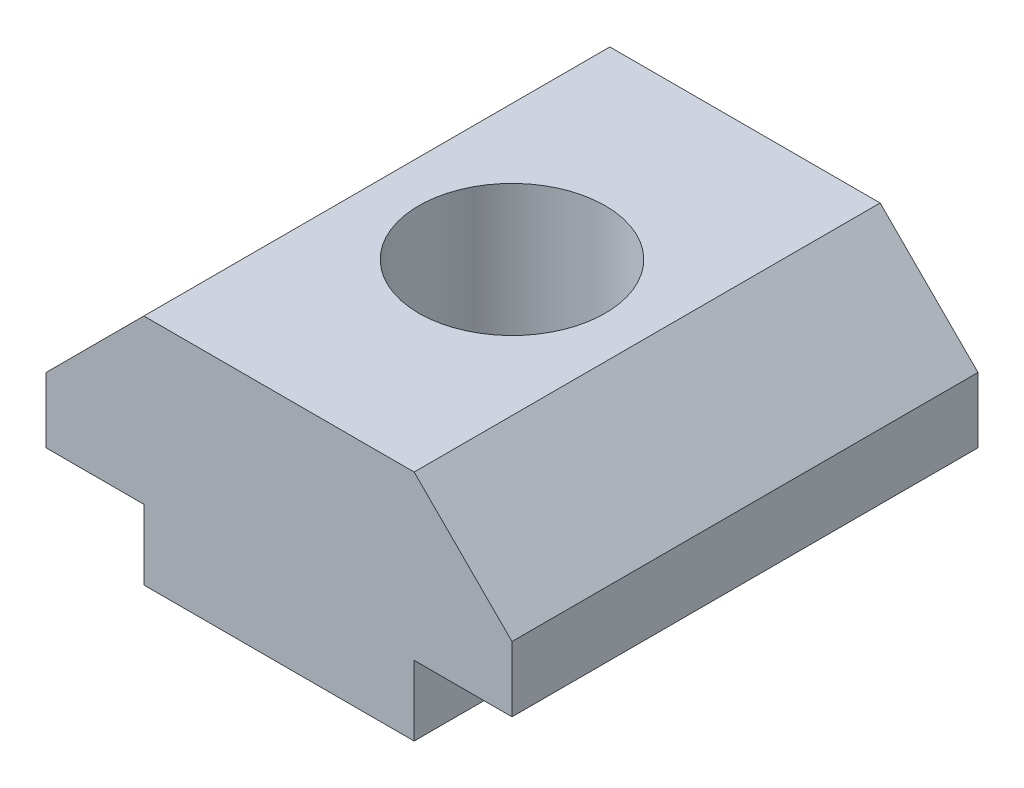
ISO-10303-21;
HEADER;
FILE_DESCRIPTION(('STEP AP214'),'2;1');
FILE_NAME('part.step','',(''),(''),'','','');
FILE_SCHEMA(('AUTOMOTIVE_DESIGN { 1 0 10303 214 1 1 1 1 }'));
ENDSEC;
DATA;
#1=APPLICATION_CONTEXT('core data for automotive mechanical design processes');
#2=APPLICATION_PROTOCOL_DEFINITION('international standard','automotive_design',2000,#1);
#3=PRODUCT_CONTEXT('',#1,'mechanical');
#4=PRODUCT('Part','Part','',(#3));
#5=PRODUCT_RELATED_PRODUCT_CATEGORY('part','',(#4));
#6=PRODUCT_DEFINITION_FORMATION('','',#4);
#7=PRODUCT_DEFINITION_CONTEXT('part definition',#1,'design');
#8=PRODUCT_DEFINITION('design','',#6,#7);
#9=PRODUCT_DEFINITION_SHAPE('','',#8);
#10=(LENGTH_UNIT() NAMED_UNIT(*) SI_UNIT(.MILLI.,.METRE.));
#11=(NAMED_UNIT(*) PLANE_ANGLE_UNIT() SI_UNIT($,.RADIAN.));
#12=(NAMED_UNIT(*) SI_UNIT($,.STERADIAN.) SOLID_ANGLE_UNIT());
#13=UNCERTAINTY_MEASURE_WITH_UNIT(LENGTH_MEASURE(1.E-05),#10,'distance_accuracy_value','');
#14=(GEOMETRIC_REPRESENTATION_CONTEXT(3) GLOBAL_UNCERTAINTY_ASSIGNED_CONTEXT((#13)) GLOBAL_UNIT_ASSIGNED_CONTEXT((#10,
#11,#12)) REPRESENTATION_CONTEXT('',''));
#15=CARTESIAN_POINT('',(0.,0.,0.));
#16=DIRECTION('',(0.,0.,1.));
#17=DIRECTION('',(1.,0.,0.));
#18=AXIS2_PLACEMENT_3D('',#15,#16,#17);
#19=CARTESIAN_POINT('',(-2.9,1.5,-10.));
#20=DIRECTION('',(-1.,0.,0.));
#21=DIRECTION('',(0.,-1.,0.));
#22=AXIS2_PLACEMENT_3D('',#19,#20,#21);
#23=PLANE('',#22);
#24=DIRECTION('',(0.,-1.,0.));
#25=VECTOR('',#24,1.);
#26=CARTESIAN_POINT('',(-2.9,1.5,0.));
#27=LINE('',#26,#25);
#28=CARTESIAN_POINT('',(-2.9,1.5,0.));
#29=VERTEX_POINT('',#28);
#30=CARTESIAN_POINT('',(-2.9,0.,0.));
#31=VERTEX_POINT('',#30);
#32=EDGE_CURVE('E143',#29,#31,#27,.T.);
#33=ORIENTED_EDGE('',*,*,#32,.F.);
#34=DIRECTION('',(0.,0.,1.));
#35=VECTOR('',#34,1.);
#36=CARTESIAN_POINT('',(-2.9,1.5,-10.));
#37=LINE('',#36,#35);
#38=CARTESIAN_POINT('',(-2.9,1.5,-10.));
#39=VERTEX_POINT('',#38);
#40=EDGE_CURVE('E11',#39,#29,#37,.T.);
#41=ORIENTED_EDGE('',*,*,#40,.F.);
#42=DIRECTION('',(0.,-1.,0.));
#43=VECTOR('',#42,1.);
#44=CARTESIAN_POINT('',(-2.9,1.5,-10.));
#45=LINE('',#44,#43);
#46=CARTESIAN_POINT('',(-2.9,0.,-10.));
#47=VERTEX_POINT('',#46);
#48=EDGE_CURVE('E170',#39,#47,#45,.T.);
#49=ORIENTED_EDGE('',*,*,#48,.T.);
#50=DIRECTION('',(0.,0.,1.));
#51=VECTOR('',#50,1.);
#52=CARTESIAN_POINT('',(-2.9,0.,-10.));
#53=LINE('',#52,#51);
#54=EDGE_CURVE('E37',#47,#31,#53,.T.);
#55=ORIENTED_EDGE('',*,*,#54,.T.);
#56=EDGE_LOOP('',(#33,#41,#49,#55));
#57=FACE_BOUND('',#56,.T.);
#58=ADVANCED_FACE('F34',(#57),#23,.T.);
#59=CARTESIAN_POINT('',(-5.,1.5,-10.));
#60=DIRECTION('',(0.,-1.,0.));
#61=DIRECTION('',(0.,0.,-1.));
#62=AXIS2_PLACEMENT_3D('',#59,#60,#61);
#63=PLANE('',#62);
#64=DIRECTION('',(1.,0.,0.));
#65=VECTOR('',#64,1.);
#66=CARTESIAN_POINT('',(-5.,1.5,0.));
#67=LINE('',#66,#65);
#68=CARTESIAN_POINT('',(-5.,1.5,0.));
#69=VERTEX_POINT('',#68);
#70=EDGE_CURVE('E168',#69,#29,#67,.T.);
#71=ORIENTED_EDGE('',*,*,#70,.F.);
#72=DIRECTION('',(0.,0.,1.));
#73=VECTOR('',#72,1.);
#74=CARTESIAN_POINT('',(-5.,1.5,-10.));
#75=LINE('',#74,#73);
#76=CARTESIAN_POINT('',(-5.,1.5,-10.));
#77=VERTEX_POINT('',#76);
#78=EDGE_CURVE('E43',#77,#69,#75,.T.);
#79=ORIENTED_EDGE('',*,*,#78,.F.);
#80=DIRECTION('',(1.,0.,0.));
#81=VECTOR('',#80,1.);
#82=CARTESIAN_POINT('',(-5.,1.5,-10.));
#83=LINE('',#82,#81);
#84=EDGE_CURVE('E133',#77,#39,#83,.T.);
#85=ORIENTED_EDGE('',*,*,#84,.T.);
#86=ORIENTED_EDGE('',*,*,#40,.T.);
#87=EDGE_LOOP('',(#71,#79,#85,#86));
#88=FACE_BOUND('',#87,.T.);
#89=ADVANCED_FACE('F186',(#88),#63,.T.);
#90=CARTESIAN_POINT('',(-5.,2.89999999999999,-10.));
#91=DIRECTION('',(-1.,0.,0.));
#92=DIRECTION('',(0.,-1.,0.));
#93=AXIS2_PLACEMENT_3D('',#90,#91,#92);
#94=PLANE('',#93);
#95=DIRECTION('',(0.,-1.,0.));
#96=VECTOR('',#95,1.);
#97=CARTESIAN_POINT('',(-5.,2.89999999999999,0.));
#98=LINE('',#97,#96);
#99=CARTESIAN_POINT('',(-5.,2.89999999999999,0.));
#100=VERTEX_POINT('',#99);
#101=EDGE_CURVE('E120',#100,#69,#98,.T.);
#102=ORIENTED_EDGE('',*,*,#101,.F.);
#103=DIRECTION('',(0.,0.,1.));
#104=VECTOR('',#103,1.);
#105=CARTESIAN_POINT('',(-5.,2.89999999999999,-10.));
#106=LINE('',#105,#104);
#107=CARTESIAN_POINT('',(-5.,2.89999999999999,-10.));
#108=VERTEX_POINT('',#107);
#109=EDGE_CURVE('E115',#108,#100,#106,.T.);
#110=ORIENTED_EDGE('',*,*,#109,.F.);
#111=DIRECTION('',(0.,-1.,0.));
#112=VECTOR('',#111,1.);
#113=CARTESIAN_POINT('',(-5.,2.89999999999999,-10.));
#114=LINE('',#113,#112);
#115=EDGE_CURVE('E118',#108,#77,#114,.T.);
#116=ORIENTED_EDGE('',*,*,#115,.T.);
#117=ORIENTED_EDGE('',*,*,#78,.T.);
#118=EDGE_LOOP('',(#102,#110,#116,#117));
#119=FACE_BOUND('',#118,.T.);
#120=ADVANCED_FACE('F117',(#119),#94,.T.);
#121=CARTESIAN_POINT('',(-2.9,5.,-10.));
#122=DIRECTION('',(-0.707106781186549,0.707106781186546,0.));
#123=DIRECTION('',(-0.707106781186546,-0.707106781186549,0.));
#124=AXIS2_PLACEMENT_3D('',#121,#122,#123);
#125=PLANE('',#124);
#126=DIRECTION('',(-0.707106781186546,-0.707106781186549,0.));
#127=VECTOR('',#126,1.);
#128=CARTESIAN_POINT('',(-2.9,5.,0.));
#129=LINE('',#128,#127);
#130=CARTESIAN_POINT('',(-2.9,5.,0.));
#131=VERTEX_POINT('',#130);
#132=EDGE_CURVE('E165',#131,#100,#129,.T.);
#133=ORIENTED_EDGE('',*,*,#132,.F.);
#134=DIRECTION('',(0.,0.,1.));
#135=VECTOR('',#134,1.);
#136=CARTESIAN_POINT('',(-2.9,5.,-10.));
#137=LINE('',#136,#135);
#138=CARTESIAN_POINT('',(-2.9,5.,-10.));
#139=VERTEX_POINT('',#138);
#140=EDGE_CURVE('E125',#139,#131,#137,.T.);
#141=ORIENTED_EDGE('',*,*,#140,.F.);
#142=DIRECTION('',(-0.707106781186546,-0.707106781186549,0.));
#143=VECTOR('',#142,1.);
#144=CARTESIAN_POINT('',(-2.9,5.,-10.));
#145=LINE('',#144,#143);
#146=EDGE_CURVE('E131',#139,#108,#145,.T.);
#147=ORIENTED_EDGE('',*,*,#146,.T.);
#148=ORIENTED_EDGE('',*,*,#109,.T.);
#149=EDGE_LOOP('',(#133,#141,#147,#148));
#150=FACE_BOUND('',#149,.T.);
#151=ADVANCED_FACE('F135',(#150),#125,.T.);
#152=CARTESIAN_POINT('',(2.9,5.,-10.));
#153=DIRECTION('',(0.,1.,0.));
#154=DIRECTION('',(0.,0.,1.));
#155=AXIS2_PLACEMENT_3D('',#152,#153,#154);
#156=PLANE('',#155);
#157=CARTESIAN_POINT('',(0.,5.,-4.99999999999773));
#158=DIRECTION('',(0.,1.,0.));
#159=DIRECTION('',(0.,0.,1.));
#160=AXIS2_PLACEMENT_3D('',#157,#158,#159);
#161=CIRCLE('',#160,2.);
#162=CARTESIAN_POINT('',(0.,5.,-2.99999999999773));
#163=VERTEX_POINT('',#162);
#164=EDGE_CURVE('E226',#163,#163,#161,.T.);
#165=ORIENTED_EDGE('',*,*,#164,.F.);
#166=EDGE_LOOP('',(#165));
#167=FACE_BOUND('',#166,.T.);
#168=DIRECTION('',(-1.,0.,0.));
#169=VECTOR('',#168,1.);
#170=CARTESIAN_POINT('',(2.9,5.,0.));
#171=LINE('',#170,#169);
#172=CARTESIAN_POINT('',(2.9,5.,0.));
#173=VERTEX_POINT('',#172);
#174=EDGE_CURVE('E162',#173,#131,#171,.T.);
#175=ORIENTED_EDGE('',*,*,#174,.F.);
#176=DIRECTION('',(0.,0.,1.));
#177=VECTOR('',#176,1.);
#178=CARTESIAN_POINT('',(2.9,5.,-10.));
#179=LINE('',#178,#177);
#180=CARTESIAN_POINT('',(2.9,5.,-10.));
#181=VERTEX_POINT('',#180);
#182=EDGE_CURVE('E174',#181,#173,#179,.T.);
#183=ORIENTED_EDGE('',*,*,#182,.F.);
#184=DIRECTION('',(-1.,0.,0.));
#185=VECTOR('',#184,1.);
#186=CARTESIAN_POINT('',(2.9,5.,-10.));
#187=LINE('',#186,#185);
#188=EDGE_CURVE('E136',#181,#139,#187,.T.);
#189=ORIENTED_EDGE('',*,*,#188,.T.);
#190=ORIENTED_EDGE('',*,*,#140,.T.);
#191=EDGE_LOOP('',(#175,#183,#189,#190));
#192=FACE_BOUND('',#191,.T.);
#193=ADVANCED_FACE('F199',(#167,#192),#156,.T.);
#194=CARTESIAN_POINT('',(5.,2.89999999999999,-10.));
#195=DIRECTION('',(0.707106781186549,0.707106781186546,0.));
#196=DIRECTION('',(-0.707106781186546,0.707106781186549,0.));
#197=AXIS2_PLACEMENT_3D('',#194,#195,#196);
#198=PLANE('',#197);
#199=DIRECTION('',(-0.707106781186546,0.707106781186549,0.));
#200=VECTOR('',#199,1.);
#201=CARTESIAN_POINT('',(5.,2.89999999999999,0.));
#202=LINE('',#201,#200);
#203=CARTESIAN_POINT('',(5.,2.89999999999999,0.));
#204=VERTEX_POINT('',#203);
#205=EDGE_CURVE('E159',#204,#173,#202,.T.);
#206=ORIENTED_EDGE('',*,*,#205,.F.);
#207=DIRECTION('',(0.,0.,1.));
#208=VECTOR('',#207,1.);
#209=CARTESIAN_POINT('',(5.,2.89999999999999,-10.));
#210=LINE('',#209,#208);
#211=CARTESIAN_POINT('',(5.,2.89999999999999,-10.));
#212=VERTEX_POINT('',#211);
#213=EDGE_CURVE('E176',#212,#204,#210,.T.);
#214=ORIENTED_EDGE('',*,*,#213,.F.);
#215=DIRECTION('',(-0.707106781186546,0.707106781186549,0.));
#216=VECTOR('',#215,1.);
#217=CARTESIAN_POINT('',(5.,2.89999999999999,-10.));
#218=LINE('',#217,#216);
#219=EDGE_CURVE('E138',#212,#181,#218,.T.);
#220=ORIENTED_EDGE('',*,*,#219,.T.);
#221=ORIENTED_EDGE('',*,*,#182,.T.);
#222=EDGE_LOOP('',(#206,#214,#220,#221));
#223=FACE_BOUND('',#222,.T.);
#224=ADVANCED_FACE('F202',(#223),#198,.T.);
#225=CARTESIAN_POINT('',(5.,1.5,-10.));
#226=DIRECTION('',(1.,0.,0.));
#227=DIRECTION('',(0.,0.,-1.));
#228=AXIS2_PLACEMENT_3D('',#225,#226,#227);
#229=PLANE('',#228);
#230=DIRECTION('',(0.,1.,0.));
#231=VECTOR('',#230,1.);
#232=CARTESIAN_POINT('',(5.,1.5,0.));
#233=LINE('',#232,#231);
#234=CARTESIAN_POINT('',(5.,1.5,0.));
#235=VERTEX_POINT('',#234);
#236=EDGE_CURVE('E156',#235,#204,#233,.T.);
#237=ORIENTED_EDGE('',*,*,#236,.F.);
#238=DIRECTION('',(0.,0.,1.));
#239=VECTOR('',#238,1.);
#240=CARTESIAN_POINT('',(5.,1.5,-10.));
#241=LINE('',#240,#239);
#242=CARTESIAN_POINT('',(5.,1.5,-10.));
#243=VERTEX_POINT('',#242);
#244=EDGE_CURVE('E178',#243,#235,#241,.T.);
#245=ORIENTED_EDGE('',*,*,#244,.F.);
#246=DIRECTION('',(0.,1.,0.));
#247=VECTOR('',#246,1.);
#248=CARTESIAN_POINT('',(5.,1.5,-10.));
#249=LINE('',#248,#247);
#250=EDGE_CURVE('E240',#243,#212,#249,.T.);
#251=ORIENTED_EDGE('',*,*,#250,.T.);
#252=ORIENTED_EDGE('',*,*,#213,.T.);
#253=EDGE_LOOP('',(#237,#245,#251,#252));
#254=FACE_BOUND('',#253,.T.);
#255=ADVANCED_FACE('F206',(#254),#229,.T.);
#256=CARTESIAN_POINT('',(2.9,1.5,-10.));
#257=DIRECTION('',(0.,-1.,0.));
#258=DIRECTION('',(1.,0.,0.));
#259=AXIS2_PLACEMENT_3D('',#256,#257,#258);
#260=PLANE('',#259);
#261=DIRECTION('',(1.,0.,0.));
#262=VECTOR('',#261,1.);
#263=CARTESIAN_POINT('',(2.9,1.5,0.));
#264=LINE('',#263,#262);
#265=CARTESIAN_POINT('',(2.9,1.5,0.));
#266=VERTEX_POINT('',#265);
#267=EDGE_CURVE('E153',#266,#235,#264,.T.);
#268=ORIENTED_EDGE('',*,*,#267,.F.);
#269=DIRECTION('',(0.,0.,1.));
#270=VECTOR('',#269,1.);
#271=CARTESIAN_POINT('',(2.9,1.5,-10.));
#272=LINE('',#271,#270);
#273=CARTESIAN_POINT('',(2.9,1.5,-10.));
#274=VERTEX_POINT('',#273);
#275=EDGE_CURVE('E180',#274,#266,#272,.T.);
#276=ORIENTED_EDGE('',*,*,#275,.F.);
#277=DIRECTION('',(1.,0.,0.));
#278=VECTOR('',#277,1.);
#279=CARTESIAN_POINT('',(2.9,1.5,-10.));
#280=LINE('',#279,#278);
#281=EDGE_CURVE('E237',#274,#243,#280,.T.);
#282=ORIENTED_EDGE('',*,*,#281,.T.);
#283=ORIENTED_EDGE('',*,*,#244,.T.);
#284=EDGE_LOOP('',(#268,#276,#282,#283));
#285=FACE_BOUND('',#284,.T.);
#286=ADVANCED_FACE('F210',(#285),#260,.T.);
#287=CARTESIAN_POINT('',(2.9,0.,-10.));
#288=DIRECTION('',(1.,0.,0.));
#289=DIRECTION('',(0.,0.,-1.));
#290=AXIS2_PLACEMENT_3D('',#287,#288,#289);
#291=PLANE('',#290);
#292=DIRECTION('',(0.,1.,0.));
#293=VECTOR('',#292,1.);
#294=CARTESIAN_POINT('',(2.9,0.,0.));
#295=LINE('',#294,#293);
#296=CARTESIAN_POINT('',(2.9,0.,0.));
#297=VERTEX_POINT('',#296);
#298=EDGE_CURVE('E150',#297,#266,#295,.T.);
#299=ORIENTED_EDGE('',*,*,#298,.F.);
#300=DIRECTION('',(0.,0.,1.));
#301=VECTOR('',#300,1.);
#302=CARTESIAN_POINT('',(2.9,0.,-10.));
#303=LINE('',#302,#301);
#304=CARTESIAN_POINT('',(2.9,0.,-10.));
#305=VERTEX_POINT('',#304);
#306=EDGE_CURVE('E181',#305,#297,#303,.T.);
#307=ORIENTED_EDGE('',*,*,#306,.F.);
#308=DIRECTION('',(0.,1.,0.));
#309=VECTOR('',#308,1.);
#310=CARTESIAN_POINT('',(2.9,0.,-10.));
#311=LINE('',#310,#309);
#312=EDGE_CURVE('E234',#305,#274,#311,.T.);
#313=ORIENTED_EDGE('',*,*,#312,.T.);
#314=ORIENTED_EDGE('',*,*,#275,.T.);
#315=EDGE_LOOP('',(#299,#307,#313,#314));
#316=FACE_BOUND('',#315,.T.);
#317=ADVANCED_FACE('F214',(#316),#291,.T.);
#318=CARTESIAN_POINT('',(-2.9,0.,-10.));
#319=DIRECTION('',(0.,-1.,0.));
#320=DIRECTION('',(0.,0.,-1.));
#321=AXIS2_PLACEMENT_3D('',#318,#319,#320);
#322=PLANE('',#321);
#323=CARTESIAN_POINT('',(0.,0.,-4.99999999999773));
#324=DIRECTION('',(0.,1.,0.));
#325=DIRECTION('',(0.,0.,1.));
#326=AXIS2_PLACEMENT_3D('',#323,#324,#325);
#327=CIRCLE('',#326,2.);
#328=CARTESIAN_POINT('',(0.,0.,-2.99999999999773));
#329=VERTEX_POINT('',#328);
#330=EDGE_CURVE('E147',#329,#329,#327,.T.);
#331=ORIENTED_EDGE('',*,*,#330,.T.);
#332=EDGE_LOOP('',(#331));
#333=FACE_BOUND('',#332,.T.);
#334=DIRECTION('',(1.,0.,0.));
#335=VECTOR('',#334,1.);
#336=CARTESIAN_POINT('',(-2.9,0.,0.));
#337=LINE('',#336,#335);
#338=EDGE_CURVE('E146',#31,#297,#337,.T.);
#339=ORIENTED_EDGE('',*,*,#338,.F.);
#340=ORIENTED_EDGE('',*,*,#54,.F.);
#341=DIRECTION('',(1.,0.,0.));
#342=VECTOR('',#341,1.);
#343=CARTESIAN_POINT('',(-2.9,0.,-10.));
#344=LINE('',#343,#342);
#345=EDGE_CURVE('E232',#47,#305,#344,.T.);
#346=ORIENTED_EDGE('',*,*,#345,.T.);
#347=ORIENTED_EDGE('',*,*,#306,.T.);
#348=EDGE_LOOP('',(#339,#340,#346,#347));
#349=FACE_BOUND('',#348,.T.);
#350=ADVANCED_FACE('F183',(#333,#349),#322,.T.);
#351=CARTESIAN_POINT('',(0.,0.,-10.));
#352=DIRECTION('',(0.,0.,1.));
#353=DIRECTION('',(1.,0.,0.));
#354=AXIS2_PLACEMENT_3D('',#351,#352,#353);
#355=PLANE('',#354);
#356=ORIENTED_EDGE('',*,*,#48,.F.);
#357=ORIENTED_EDGE('',*,*,#84,.F.);
#358=ORIENTED_EDGE('',*,*,#115,.F.);
#359=ORIENTED_EDGE('',*,*,#146,.F.);
#360=ORIENTED_EDGE('',*,*,#188,.F.);
#361=ORIENTED_EDGE('',*,*,#219,.F.);
#362=ORIENTED_EDGE('',*,*,#250,.F.);
#363=ORIENTED_EDGE('',*,*,#281,.F.);
#364=ORIENTED_EDGE('',*,*,#312,.F.);
#365=ORIENTED_EDGE('',*,*,#345,.F.);
#366=EDGE_LOOP('',(#356,#357,#358,#359,#360,#361,#362,#363,#364,#365));
#367=FACE_BOUND('',#366,.T.);
#368=ADVANCED_FACE('F129',(#367),#355,.F.);
#369=CARTESIAN_POINT('',(0.,0.,0.));
#370=DIRECTION('',(0.,0.,1.));
#371=DIRECTION('',(1.,0.,0.));
#372=AXIS2_PLACEMENT_3D('',#369,#370,#371);
#373=PLANE('',#372);
#374=ORIENTED_EDGE('',*,*,#32,.T.);
#375=ORIENTED_EDGE('',*,*,#338,.T.);
#376=ORIENTED_EDGE('',*,*,#298,.T.);
#377=ORIENTED_EDGE('',*,*,#267,.T.);
#378=ORIENTED_EDGE('',*,*,#236,.T.);
#379=ORIENTED_EDGE('',*,*,#205,.T.);
#380=ORIENTED_EDGE('',*,*,#174,.T.);
#381=ORIENTED_EDGE('',*,*,#132,.T.);
#382=ORIENTED_EDGE('',*,*,#101,.T.);
#383=ORIENTED_EDGE('',*,*,#70,.T.);
#384=EDGE_LOOP('',(#374,#375,#376,#377,#378,#379,#380,#381,#382,#383));
#385=FACE_BOUND('',#384,.T.);
#386=ADVANCED_FACE('F185',(#385),#373,.T.);
#387=CARTESIAN_POINT('',(0.,0.,-4.99999999999773));
#388=DIRECTION('',(0.,1.,0.));
#389=DIRECTION('',(0.,0.,1.));
#390=AXIS2_PLACEMENT_3D('',#387,#388,#389);
#391=CYLINDRICAL_SURFACE('',#390,2.);
#392=ORIENTED_EDGE('',*,*,#330,.F.);
#393=EDGE_LOOP('',(#392));
#394=FACE_BOUND('',#393,.T.);
#395=ORIENTED_EDGE('',*,*,#164,.T.);
#396=EDGE_LOOP('',(#395));
#397=FACE_BOUND('',#396,.T.);
#398=ADVANCED_FACE('F254',(#394,#397),#391,.F.);
#399=CLOSED_SHELL('',(#58,#89,#120,#151,#193,#224,#255,#286,#317,#350,#368,#386,#398));
#400=MANIFOLD_SOLID_BREP('B2',#399);
#401=ADVANCED_BREP_SHAPE_REPRESENTATION('',(#18,#400),#14);
#402=SHAPE_DEFINITION_REPRESENTATION(#9,#401);
ENDSEC;
END-ISO-10303-21;
